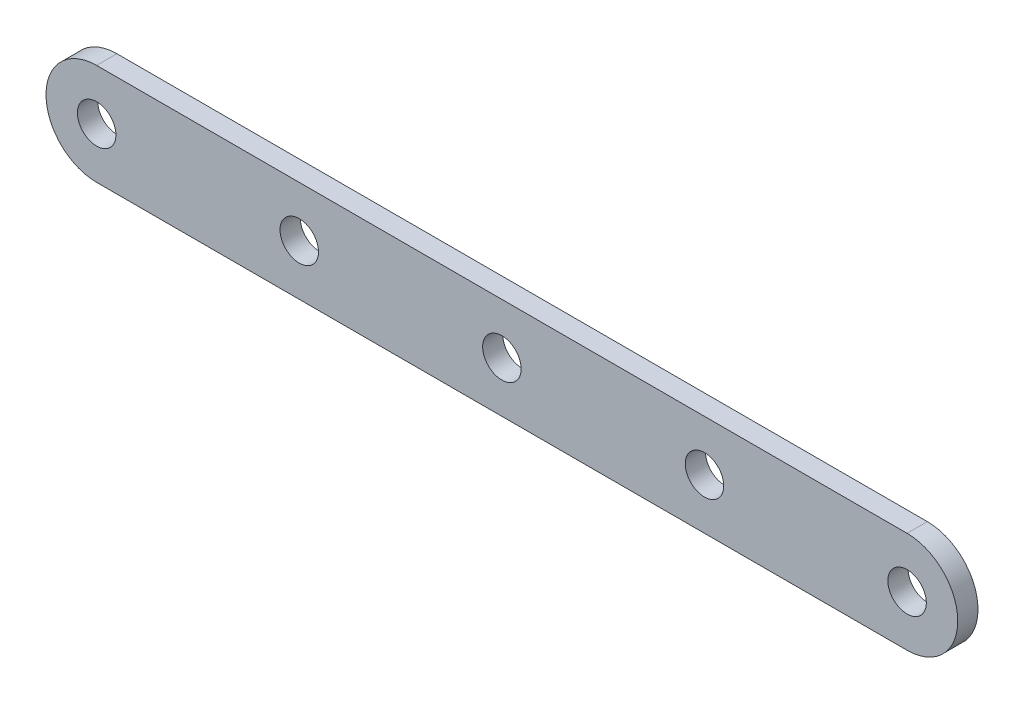
ISO-10303-21;
HEADER;
FILE_DESCRIPTION(('STEP AP214'),'2;1');
FILE_NAME('part.step','',(''),(''),'','','');
FILE_SCHEMA(('AUTOMOTIVE_DESIGN { 1 0 10303 214 1 1 1 1 }'));
ENDSEC;
DATA;
#1=APPLICATION_CONTEXT('core data for automotive mechanical design processes');
#2=APPLICATION_PROTOCOL_DEFINITION('international standard','automotive_design',2000,#1);
#3=PRODUCT_CONTEXT('',#1,'mechanical');
#4=PRODUCT('Part','Part','',(#3));
#5=PRODUCT_RELATED_PRODUCT_CATEGORY('part','',(#4));
#6=PRODUCT_DEFINITION_FORMATION('','',#4);
#7=PRODUCT_DEFINITION_CONTEXT('part definition',#1,'design');
#8=PRODUCT_DEFINITION('design','',#6,#7);
#9=PRODUCT_DEFINITION_SHAPE('','',#8);
#10=(LENGTH_UNIT() NAMED_UNIT(*) SI_UNIT(.MILLI.,.METRE.));
#11=(NAMED_UNIT(*) PLANE_ANGLE_UNIT() SI_UNIT($,.RADIAN.));
#12=(NAMED_UNIT(*) SI_UNIT($,.STERADIAN.) SOLID_ANGLE_UNIT());
#13=UNCERTAINTY_MEASURE_WITH_UNIT(LENGTH_MEASURE(1.E-05),#10,'distance_accuracy_value','');
#14=(GEOMETRIC_REPRESENTATION_CONTEXT(3) GLOBAL_UNCERTAINTY_ASSIGNED_CONTEXT((#13)) GLOBAL_UNIT_ASSIGNED_CONTEXT((#10,
#11,#12)) REPRESENTATION_CONTEXT('',''));
#15=CARTESIAN_POINT('',(0.,0.,0.));
#16=DIRECTION('',(0.,0.,1.));
#17=DIRECTION('',(1.,0.,0.));
#18=AXIS2_PLACEMENT_3D('',#15,#16,#17);
#19=CARTESIAN_POINT('',(22.86,-5.81121212121212,-1.27));
#20=DIRECTION('',(0.,0.,1.));
#21=DIRECTION('',(1.,0.,0.));
#22=AXIS2_PLACEMENT_3D('',#19,#20,#21);
#23=CYLINDRICAL_SURFACE('',#22,2.413);
#24=CARTESIAN_POINT('',(22.86,-5.81121212121212,-1.27));
#25=DIRECTION('',(0.,0.,1.));
#26=DIRECTION('',(1.,0.,0.));
#27=AXIS2_PLACEMENT_3D('',#24,#25,#26);
#28=CIRCLE('',#27,2.413);
#29=CARTESIAN_POINT('',(25.273,-5.81121212121212,-1.27));
#30=VERTEX_POINT('',#29);
#31=EDGE_CURVE('E47',#30,#30,#28,.T.);
#32=ORIENTED_EDGE('',*,*,#31,.F.);
#33=EDGE_LOOP('',(#32));
#34=FACE_BOUND('',#33,.T.);
#35=CARTESIAN_POINT('',(22.86,-5.81121212121212,1.27));
#36=DIRECTION('',(0.,0.,1.));
#37=DIRECTION('',(1.,0.,0.));
#38=AXIS2_PLACEMENT_3D('',#35,#36,#37);
#39=CIRCLE('',#38,2.413);
#40=CARTESIAN_POINT('',(25.273,-5.81121212121212,1.27));
#41=VERTEX_POINT('',#40);
#42=EDGE_CURVE('E11',#41,#41,#39,.T.);
#43=ORIENTED_EDGE('',*,*,#42,.T.);
#44=EDGE_LOOP('',(#43));
#45=FACE_BOUND('',#44,.T.);
#46=ADVANCED_FACE('F39',(#34,#45),#23,.F.);
#47=CARTESIAN_POINT('',(-2.54,-5.81121212121212,-1.27));
#48=DIRECTION('',(0.,0.,1.));
#49=DIRECTION('',(1.,0.,0.));
#50=AXIS2_PLACEMENT_3D('',#47,#48,#49);
#51=CYLINDRICAL_SURFACE('',#50,2.413);
#52=CARTESIAN_POINT('',(-2.54,-5.81121212121212,-1.27));
#53=DIRECTION('',(0.,0.,1.));
#54=DIRECTION('',(1.,0.,0.));
#55=AXIS2_PLACEMENT_3D('',#52,#53,#54);
#56=CIRCLE('',#55,2.413);
#57=CARTESIAN_POINT('',(-0.127000000000005,-5.81121212121212,-1.27));
#58=VERTEX_POINT('',#57);
#59=EDGE_CURVE('E117',#58,#58,#56,.T.);
#60=ORIENTED_EDGE('',*,*,#59,.F.);
#61=EDGE_LOOP('',(#60));
#62=FACE_BOUND('',#61,.T.);
#63=CARTESIAN_POINT('',(-2.54,-5.81121212121212,1.27));
#64=DIRECTION('',(0.,0.,1.));
#65=DIRECTION('',(1.,0.,0.));
#66=AXIS2_PLACEMENT_3D('',#63,#64,#65);
#67=CIRCLE('',#66,2.413);
#68=CARTESIAN_POINT('',(-0.127000000000005,-5.81121212121212,1.27));
#69=VERTEX_POINT('',#68);
#70=EDGE_CURVE('E120',#69,#69,#67,.T.);
#71=ORIENTED_EDGE('',*,*,#70,.T.);
#72=EDGE_LOOP('',(#71));
#73=FACE_BOUND('',#72,.T.);
#74=ADVANCED_FACE('F129',(#62,#73),#51,.F.);
#75=CARTESIAN_POINT('',(-53.34,-5.81121212121213,1.27));
#76=DIRECTION('',(0.,0.,-1.));
#77=DIRECTION('',(-1.,0.,0.));
#78=AXIS2_PLACEMENT_3D('',#75,#76,#77);
#79=CYLINDRICAL_SURFACE('',#78,6.35);
#80=CARTESIAN_POINT('',(-53.34,-5.81121212121213,-1.27));
#81=DIRECTION('',(0.,0.,1.));
#82=DIRECTION('',(1.,0.,0.));
#83=AXIS2_PLACEMENT_3D('',#80,#81,#82);
#84=CIRCLE('',#83,6.35);
#85=CARTESIAN_POINT('',(-53.34,0.538787878787872,-1.27));
#86=VERTEX_POINT('',#85);
#87=CARTESIAN_POINT('',(-53.34,-12.1612121212121,-1.27));
#88=VERTEX_POINT('',#87);
#89=EDGE_CURVE('E107',#86,#88,#84,.T.);
#90=ORIENTED_EDGE('',*,*,#89,.T.);
#91=DIRECTION('',(0.,0.,-1.));
#92=VECTOR('',#91,1.);
#93=CARTESIAN_POINT('',(-53.34,-12.1612121212121,1.27));
#94=LINE('',#93,#92);
#95=CARTESIAN_POINT('',(-53.34,-12.1612121212121,1.27));
#96=VERTEX_POINT('',#95);
#97=EDGE_CURVE('E98',#96,#88,#94,.T.);
#98=ORIENTED_EDGE('',*,*,#97,.F.);
#99=CARTESIAN_POINT('',(-53.34,-5.81121212121213,1.27));
#100=DIRECTION('',(0.,0.,1.));
#101=DIRECTION('',(1.,0.,0.));
#102=AXIS2_PLACEMENT_3D('',#99,#100,#101);
#103=CIRCLE('',#102,6.35);
#104=CARTESIAN_POINT('',(-53.34,0.538787878787872,1.27));
#105=VERTEX_POINT('',#104);
#106=EDGE_CURVE('E92',#105,#96,#103,.T.);
#107=ORIENTED_EDGE('',*,*,#106,.F.);
#108=DIRECTION('',(0.,0.,-1.));
#109=VECTOR('',#108,1.);
#110=CARTESIAN_POINT('',(-53.34,0.538787878787872,1.27));
#111=LINE('',#110,#109);
#112=EDGE_CURVE('E103',#105,#86,#111,.T.);
#113=ORIENTED_EDGE('',*,*,#112,.T.);
#114=EDGE_LOOP('',(#90,#98,#107,#113));
#115=FACE_BOUND('',#114,.T.);
#116=ADVANCED_FACE('F154',(#115),#79,.T.);
#117=CARTESIAN_POINT('',(48.26,-12.1612121212121,1.27));
#118=DIRECTION('',(0.,1.,0.));
#119=DIRECTION('',(-1.,0.,0.));
#120=AXIS2_PLACEMENT_3D('',#117,#118,#119);
#121=PLANE('',#120);
#122=DIRECTION('',(1.,0.,0.));
#123=VECTOR('',#122,1.);
#124=CARTESIAN_POINT('',(48.26,-12.1612121212121,-1.27));
#125=LINE('',#124,#123);
#126=CARTESIAN_POINT('',(48.26,-12.1612121212121,-1.27));
#127=VERTEX_POINT('',#126);
#128=EDGE_CURVE('E97',#88,#127,#125,.T.);
#129=ORIENTED_EDGE('',*,*,#128,.T.);
#130=DIRECTION('',(0.,0.,-1.));
#131=VECTOR('',#130,1.);
#132=CARTESIAN_POINT('',(48.26,-12.1612121212121,1.27));
#133=LINE('',#132,#131);
#134=CARTESIAN_POINT('',(48.26,-12.1612121212121,1.27));
#135=VERTEX_POINT('',#134);
#136=EDGE_CURVE('E95',#135,#127,#133,.T.);
#137=ORIENTED_EDGE('',*,*,#136,.F.);
#138=DIRECTION('',(1.,0.,0.));
#139=VECTOR('',#138,1.);
#140=CARTESIAN_POINT('',(48.26,-12.1612121212121,1.27));
#141=LINE('',#140,#139);
#142=EDGE_CURVE('E86',#96,#135,#141,.T.);
#143=ORIENTED_EDGE('',*,*,#142,.F.);
#144=ORIENTED_EDGE('',*,*,#97,.T.);
#145=EDGE_LOOP('',(#129,#137,#143,#144));
#146=FACE_BOUND('',#145,.T.);
#147=ADVANCED_FACE('F96',(#146),#121,.F.);
#148=CARTESIAN_POINT('',(48.26,-5.81121212121212,1.27));
#149=DIRECTION('',(0.,0.,-1.));
#150=DIRECTION('',(-1.,0.,0.));
#151=AXIS2_PLACEMENT_3D('',#148,#149,#150);
#152=CYLINDRICAL_SURFACE('',#151,6.35);
#153=CARTESIAN_POINT('',(48.26,-5.81121212121212,-1.27));
#154=DIRECTION('',(0.,0.,1.));
#155=DIRECTION('',(-1.,0.,0.));
#156=AXIS2_PLACEMENT_3D('',#153,#154,#155);
#157=CIRCLE('',#156,6.35);
#158=CARTESIAN_POINT('',(48.26,0.538787878787884,-1.27));
#159=VERTEX_POINT('',#158);
#160=EDGE_CURVE('E72',#127,#159,#157,.T.);
#161=ORIENTED_EDGE('',*,*,#160,.T.);
#162=DIRECTION('',(0.,0.,-1.));
#163=VECTOR('',#162,1.);
#164=CARTESIAN_POINT('',(48.26,0.538787878787884,1.27));
#165=LINE('',#164,#163);
#166=CARTESIAN_POINT('',(48.26,0.538787878787884,1.27));
#167=VERTEX_POINT('',#166);
#168=EDGE_CURVE('E99',#167,#159,#165,.T.);
#169=ORIENTED_EDGE('',*,*,#168,.F.);
#170=CARTESIAN_POINT('',(48.26,-5.81121212121212,1.27));
#171=DIRECTION('',(0.,0.,1.));
#172=DIRECTION('',(-1.,0.,0.));
#173=AXIS2_PLACEMENT_3D('',#170,#171,#172);
#174=CIRCLE('',#173,6.35);
#175=EDGE_CURVE('E90',#135,#167,#174,.T.);
#176=ORIENTED_EDGE('',*,*,#175,.F.);
#177=ORIENTED_EDGE('',*,*,#136,.T.);
#178=EDGE_LOOP('',(#161,#169,#176,#177));
#179=FACE_BOUND('',#178,.T.);
#180=ADVANCED_FACE('F101',(#179),#152,.T.);
#181=CARTESIAN_POINT('',(48.26,0.538787878787884,1.27));
#182=DIRECTION('',(0.,-1.,0.));
#183=DIRECTION('',(1.,0.,0.));
#184=AXIS2_PLACEMENT_3D('',#181,#182,#183);
#185=PLANE('',#184);
#186=DIRECTION('',(-1.,0.,0.));
#187=VECTOR('',#186,1.);
#188=CARTESIAN_POINT('',(48.26,0.538787878787884,-1.27));
#189=LINE('',#188,#187);
#190=EDGE_CURVE('E78',#159,#86,#189,.T.);
#191=ORIENTED_EDGE('',*,*,#190,.T.);
#192=ORIENTED_EDGE('',*,*,#112,.F.);
#193=DIRECTION('',(-1.,0.,0.));
#194=VECTOR('',#193,1.);
#195=CARTESIAN_POINT('',(48.26,0.538787878787884,1.27));
#196=LINE('',#195,#194);
#197=EDGE_CURVE('E55',#167,#105,#196,.T.);
#198=ORIENTED_EDGE('',*,*,#197,.F.);
#199=ORIENTED_EDGE('',*,*,#168,.T.);
#200=EDGE_LOOP('',(#191,#192,#198,#199));
#201=FACE_BOUND('',#200,.T.);
#202=ADVANCED_FACE('F133',(#201),#185,.F.);
#203=CARTESIAN_POINT('',(-53.34,-5.81121212121213,1.27));
#204=DIRECTION('',(0.,0.,1.));
#205=DIRECTION('',(1.,0.,0.));
#206=AXIS2_PLACEMENT_3D('',#203,#204,#205);
#207=PLANE('',#206);
#208=CARTESIAN_POINT('',(48.26,-5.81121212121212,1.27));
#209=DIRECTION('',(0.,0.,1.));
#210=DIRECTION('',(1.,0.,0.));
#211=AXIS2_PLACEMENT_3D('',#208,#209,#210);
#212=CIRCLE('',#211,2.413);
#213=CARTESIAN_POINT('',(50.673,-5.81121212121212,1.27));
#214=VERTEX_POINT('',#213);
#215=EDGE_CURVE('E240',#214,#214,#212,.T.);
#216=ORIENTED_EDGE('',*,*,#215,.F.);
#217=EDGE_LOOP('',(#216));
#218=FACE_BOUND('',#217,.T.);
#219=CARTESIAN_POINT('',(-27.94,-5.81121212121212,1.27));
#220=DIRECTION('',(0.,0.,1.));
#221=DIRECTION('',(1.,0.,0.));
#222=AXIS2_PLACEMENT_3D('',#219,#220,#221);
#223=CIRCLE('',#222,2.413);
#224=CARTESIAN_POINT('',(-25.527,-5.81121212121212,1.27));
#225=VERTEX_POINT('',#224);
#226=EDGE_CURVE('E247',#225,#225,#223,.T.);
#227=ORIENTED_EDGE('',*,*,#226,.F.);
#228=EDGE_LOOP('',(#227));
#229=FACE_BOUND('',#228,.T.);
#230=CARTESIAN_POINT('',(-53.34,-5.81121212121213,1.27));
#231=DIRECTION('',(0.,0.,1.));
#232=DIRECTION('',(1.,0.,0.));
#233=AXIS2_PLACEMENT_3D('',#230,#231,#232);
#234=CIRCLE('',#233,2.413);
#235=CARTESIAN_POINT('',(-50.927,-5.81121212121213,1.27));
#236=VERTEX_POINT('',#235);
#237=EDGE_CURVE('E250',#236,#236,#234,.T.);
#238=ORIENTED_EDGE('',*,*,#237,.F.);
#239=EDGE_LOOP('',(#238));
#240=FACE_BOUND('',#239,.T.);
#241=ORIENTED_EDGE('',*,*,#106,.T.);
#242=ORIENTED_EDGE('',*,*,#142,.T.);
#243=ORIENTED_EDGE('',*,*,#175,.T.);
#244=ORIENTED_EDGE('',*,*,#197,.T.);
#245=EDGE_LOOP('',(#241,#242,#243,#244));
#246=FACE_BOUND('',#245,.T.);
#247=ORIENTED_EDGE('',*,*,#70,.F.);
#248=EDGE_LOOP('',(#247));
#249=FACE_BOUND('',#248,.T.);
#250=ORIENTED_EDGE('',*,*,#42,.F.);
#251=EDGE_LOOP('',(#250));
#252=FACE_BOUND('',#251,.T.);
#253=ADVANCED_FACE('F87',(#218,#229,#240,#246,#249,#252),#207,.T.);
#254=CARTESIAN_POINT('',(-53.34,-5.81121212121213,-1.27));
#255=DIRECTION('',(0.,0.,1.));
#256=DIRECTION('',(1.,0.,0.));
#257=AXIS2_PLACEMENT_3D('',#254,#255,#256);
#258=PLANE('',#257);
#259=CARTESIAN_POINT('',(48.26,-5.81121212121212,-1.27));
#260=DIRECTION('',(0.,0.,1.));
#261=DIRECTION('',(1.,0.,0.));
#262=AXIS2_PLACEMENT_3D('',#259,#260,#261);
#263=CIRCLE('',#262,2.413);
#264=CARTESIAN_POINT('',(50.673,-5.81121212121212,-1.27));
#265=VERTEX_POINT('',#264);
#266=EDGE_CURVE('E238',#265,#265,#263,.T.);
#267=ORIENTED_EDGE('',*,*,#266,.T.);
#268=EDGE_LOOP('',(#267));
#269=FACE_BOUND('',#268,.T.);
#270=CARTESIAN_POINT('',(-27.94,-5.81121212121212,-1.27));
#271=DIRECTION('',(0.,0.,1.));
#272=DIRECTION('',(1.,0.,0.));
#273=AXIS2_PLACEMENT_3D('',#270,#271,#272);
#274=CIRCLE('',#273,2.413);
#275=CARTESIAN_POINT('',(-25.527,-5.81121212121212,-1.27));
#276=VERTEX_POINT('',#275);
#277=EDGE_CURVE('E242',#276,#276,#274,.T.);
#278=ORIENTED_EDGE('',*,*,#277,.T.);
#279=EDGE_LOOP('',(#278));
#280=FACE_BOUND('',#279,.T.);
#281=CARTESIAN_POINT('',(-53.34,-5.81121212121213,-1.27));
#282=DIRECTION('',(0.,0.,1.));
#283=DIRECTION('',(1.,0.,0.));
#284=AXIS2_PLACEMENT_3D('',#281,#282,#283);
#285=CIRCLE('',#284,2.413);
#286=CARTESIAN_POINT('',(-50.927,-5.81121212121213,-1.27));
#287=VERTEX_POINT('',#286);
#288=EDGE_CURVE('E110',#287,#287,#285,.T.);
#289=ORIENTED_EDGE('',*,*,#288,.T.);
#290=EDGE_LOOP('',(#289));
#291=FACE_BOUND('',#290,.T.);
#292=ORIENTED_EDGE('',*,*,#89,.F.);
#293=ORIENTED_EDGE('',*,*,#190,.F.);
#294=ORIENTED_EDGE('',*,*,#160,.F.);
#295=ORIENTED_EDGE('',*,*,#128,.F.);
#296=EDGE_LOOP('',(#292,#293,#294,#295));
#297=FACE_BOUND('',#296,.T.);
#298=ORIENTED_EDGE('',*,*,#59,.T.);
#299=EDGE_LOOP('',(#298));
#300=FACE_BOUND('',#299,.T.);
#301=ORIENTED_EDGE('',*,*,#31,.T.);
#302=EDGE_LOOP('',(#301));
#303=FACE_BOUND('',#302,.T.);
#304=ADVANCED_FACE('F125',(#269,#280,#291,#297,#300,#303),#258,.F.);
#305=CARTESIAN_POINT('',(-53.34,-5.81121212121213,-1.27));
#306=DIRECTION('',(0.,0.,1.));
#307=DIRECTION('',(1.,0.,0.));
#308=AXIS2_PLACEMENT_3D('',#305,#306,#307);
#309=CYLINDRICAL_SURFACE('',#308,2.413);
#310=ORIENTED_EDGE('',*,*,#288,.F.);
#311=EDGE_LOOP('',(#310));
#312=FACE_BOUND('',#311,.T.);
#313=ORIENTED_EDGE('',*,*,#237,.T.);
#314=EDGE_LOOP('',(#313));
#315=FACE_BOUND('',#314,.T.);
#316=ADVANCED_FACE('F140',(#312,#315),#309,.F.);
#317=CARTESIAN_POINT('',(-27.94,-5.81121212121212,-1.27));
#318=DIRECTION('',(0.,0.,1.));
#319=DIRECTION('',(1.,0.,0.));
#320=AXIS2_PLACEMENT_3D('',#317,#318,#319);
#321=CYLINDRICAL_SURFACE('',#320,2.413);
#322=ORIENTED_EDGE('',*,*,#277,.F.);
#323=EDGE_LOOP('',(#322));
#324=FACE_BOUND('',#323,.T.);
#325=ORIENTED_EDGE('',*,*,#226,.T.);
#326=EDGE_LOOP('',(#325));
#327=FACE_BOUND('',#326,.T.);
#328=ADVANCED_FACE('F176',(#324,#327),#321,.F.);
#329=CARTESIAN_POINT('',(48.26,-5.81121212121212,-1.27));
#330=DIRECTION('',(0.,0.,1.));
#331=DIRECTION('',(1.,0.,0.));
#332=AXIS2_PLACEMENT_3D('',#329,#330,#331);
#333=CYLINDRICAL_SURFACE('',#332,2.413);
#334=ORIENTED_EDGE('',*,*,#266,.F.);
#335=EDGE_LOOP('',(#334));
#336=FACE_BOUND('',#335,.T.);
#337=ORIENTED_EDGE('',*,*,#215,.T.);
#338=EDGE_LOOP('',(#337));
#339=FACE_BOUND('',#338,.T.);
#340=ADVANCED_FACE('F218',(#336,#339),#333,.F.);
#341=CLOSED_SHELL('',(#46,#74,#116,#147,#180,#202,#253,#304,#316,#328,#340));
#342=MANIFOLD_SOLID_BREP('B2',#341);
#343=ADVANCED_BREP_SHAPE_REPRESENTATION('',(#18,#342),#14);
#344=SHAPE_DEFINITION_REPRESENTATION(#9,#343);
ENDSEC;
END-ISO-10303-21;
